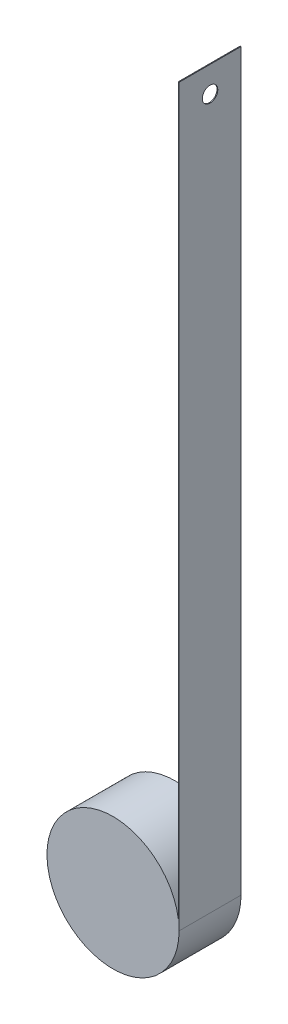
ISO-10303-21;
HEADER;
FILE_DESCRIPTION(('STEP AP214'),'2;1');
FILE_NAME('part.step','',(''),(''),'','','');
FILE_SCHEMA(('AUTOMOTIVE_DESIGN { 1 0 10303 214 1 1 1 1 }'));
ENDSEC;
DATA;
#1=APPLICATION_CONTEXT('core data for automotive mechanical design processes');
#2=APPLICATION_PROTOCOL_DEFINITION('international standard','automotive_design',2000,#1);
#3=PRODUCT_CONTEXT('',#1,'mechanical');
#4=PRODUCT('Part','Part','',(#3));
#5=PRODUCT_RELATED_PRODUCT_CATEGORY('part','',(#4));
#6=PRODUCT_DEFINITION_FORMATION('','',#4);
#7=PRODUCT_DEFINITION_CONTEXT('part definition',#1,'design');
#8=PRODUCT_DEFINITION('design','',#6,#7);
#9=PRODUCT_DEFINITION_SHAPE('','',#8);
#10=(LENGTH_UNIT() NAMED_UNIT(*) SI_UNIT(.MILLI.,.METRE.));
#11=(NAMED_UNIT(*) PLANE_ANGLE_UNIT() SI_UNIT($,.RADIAN.));
#12=(NAMED_UNIT(*) SI_UNIT($,.STERADIAN.) SOLID_ANGLE_UNIT());
#13=UNCERTAINTY_MEASURE_WITH_UNIT(LENGTH_MEASURE(1.E-05),#10,'distance_accuracy_value','');
#14=(GEOMETRIC_REPRESENTATION_CONTEXT(3) GLOBAL_UNCERTAINTY_ASSIGNED_CONTEXT((#13)) GLOBAL_UNIT_ASSIGNED_CONTEXT((#10,
#11,#12)) REPRESENTATION_CONTEXT('',''));
#15=CARTESIAN_POINT('',(0.,0.,0.));
#16=DIRECTION('',(0.,0.,1.));
#17=DIRECTION('',(1.,0.,0.));
#18=AXIS2_PLACEMENT_3D('',#15,#16,#17);
#19=CARTESIAN_POINT('',(0.,0.,19.05));
#20=DIRECTION('',(0.,0.,-1.));
#21=DIRECTION('',(-1.,0.,0.));
#22=AXIS2_PLACEMENT_3D('',#19,#20,#21);
#23=CYLINDRICAL_SURFACE('',#22,20.32);
#24=CARTESIAN_POINT('',(0.,0.,0.));
#25=DIRECTION('',(0.,0.,1.));
#26=DIRECTION('',(1.,0.,0.));
#27=AXIS2_PLACEMENT_3D('',#24,#25,#26);
#28=CIRCLE('',#27,20.32);
#29=CARTESIAN_POINT('',(20.066,3.20281813408117,0.));
#30=VERTEX_POINT('',#29);
#31=CARTESIAN_POINT('',(20.32,0.,0.));
#32=VERTEX_POINT('',#31);
#33=EDGE_CURVE('E397',#30,#32,#28,.T.);
#34=ORIENTED_EDGE('',*,*,#33,.T.);
#35=DIRECTION('',(0.,0.,-1.));
#36=VECTOR('',#35,1.);
#37=CARTESIAN_POINT('',(20.32,0.,19.05));
#38=LINE('',#37,#36);
#39=CARTESIAN_POINT('',(20.32,0.,19.05));
#40=VERTEX_POINT('',#39);
#41=EDGE_CURVE('E11',#40,#32,#38,.T.);
#42=ORIENTED_EDGE('',*,*,#41,.F.);
#43=CARTESIAN_POINT('',(0.,0.,19.05));
#44=DIRECTION('',(0.,0.,1.));
#45=DIRECTION('',(1.,0.,0.));
#46=AXIS2_PLACEMENT_3D('',#43,#44,#45);
#47=CIRCLE('',#46,20.32);
#48=CARTESIAN_POINT('',(20.066,3.20281813408117,19.05));
#49=VERTEX_POINT('',#48);
#50=EDGE_CURVE('E418',#49,#40,#47,.T.);
#51=ORIENTED_EDGE('',*,*,#50,.F.);
#52=DIRECTION('',(0.,0.,-1.));
#53=VECTOR('',#52,1.);
#54=CARTESIAN_POINT('',(20.066,3.20281813408117,19.05));
#55=LINE('',#54,#53);
#56=EDGE_CURVE('E409',#49,#30,#55,.T.);
#57=ORIENTED_EDGE('',*,*,#56,.T.);
#58=EDGE_LOOP('',(#34,#42,#51,#57));
#59=FACE_BOUND('',#58,.T.);
#60=ADVANCED_FACE('F352',(#59),#23,.T.);
#61=CARTESIAN_POINT('',(20.32,0.,19.05));
#62=DIRECTION('',(-1.,0.,0.));
#63=DIRECTION('',(0.,-1.,0.));
#64=AXIS2_PLACEMENT_3D('',#61,#62,#63);
#65=PLANE('',#64);
#66=CARTESIAN_POINT('',(20.32,218.1225,9.525));
#67=DIRECTION('',(1.,0.,0.));
#68=DIRECTION('',(0.,1.,0.));
#69=AXIS2_PLACEMENT_3D('',#66,#67,#68);
#70=CIRCLE('',#69,2.38125);
#71=CARTESIAN_POINT('',(20.32,220.50375,9.525));
#72=VERTEX_POINT('',#71);
#73=EDGE_CURVE('E412',#72,#72,#70,.T.);
#74=ORIENTED_EDGE('',*,*,#73,.F.);
#75=EDGE_LOOP('',(#74));
#76=FACE_BOUND('',#75,.T.);
#77=DIRECTION('',(0.,1.,0.));
#78=VECTOR('',#77,1.);
#79=CARTESIAN_POINT('',(20.32,0.,0.));
#80=LINE('',#79,#78);
#81=CARTESIAN_POINT('',(20.32,226.06,0.));
#82=VERTEX_POINT('',#81);
#83=EDGE_CURVE('E393',#32,#82,#80,.T.);
#84=ORIENTED_EDGE('',*,*,#83,.T.);
#85=DIRECTION('',(0.,0.,-1.));
#86=VECTOR('',#85,1.);
#87=CARTESIAN_POINT('',(20.32,226.06,19.05));
#88=LINE('',#87,#86);
#89=CARTESIAN_POINT('',(20.32,226.06,19.05));
#90=VERTEX_POINT('',#89);
#91=EDGE_CURVE('E360',#90,#82,#88,.T.);
#92=ORIENTED_EDGE('',*,*,#91,.F.);
#93=DIRECTION('',(0.,1.,0.));
#94=VECTOR('',#93,1.);
#95=CARTESIAN_POINT('',(20.32,0.,19.05));
#96=LINE('',#95,#94);
#97=EDGE_CURVE('E405',#40,#90,#96,.T.);
#98=ORIENTED_EDGE('',*,*,#97,.F.);
#99=ORIENTED_EDGE('',*,*,#41,.T.);
#100=EDGE_LOOP('',(#84,#92,#98,#99));
#101=FACE_BOUND('',#100,.T.);
#102=ADVANCED_FACE('F404',(#76,#101),#65,.F.);
#103=CARTESIAN_POINT('',(20.32,226.06,19.05));
#104=DIRECTION('',(0.,-1.,0.));
#105=DIRECTION('',(0.,0.,-1.));
#106=AXIS2_PLACEMENT_3D('',#103,#104,#105);
#107=PLANE('',#106);
#108=DIRECTION('',(-1.,0.,0.));
#109=VECTOR('',#108,1.);
#110=CARTESIAN_POINT('',(20.32,226.06,0.));
#111=LINE('',#110,#109);
#112=CARTESIAN_POINT('',(20.066,226.06,0.));
#113=VERTEX_POINT('',#112);
#114=EDGE_CURVE('E398',#82,#113,#111,.T.);
#115=ORIENTED_EDGE('',*,*,#114,.T.);
#116=DIRECTION('',(0.,0.,-1.));
#117=VECTOR('',#116,1.);
#118=CARTESIAN_POINT('',(20.066,226.06,19.05));
#119=LINE('',#118,#117);
#120=CARTESIAN_POINT('',(20.066,226.06,19.05));
#121=VERTEX_POINT('',#120);
#122=EDGE_CURVE('E424',#121,#113,#119,.T.);
#123=ORIENTED_EDGE('',*,*,#122,.F.);
#124=DIRECTION('',(-1.,0.,0.));
#125=VECTOR('',#124,1.);
#126=CARTESIAN_POINT('',(20.32,226.06,19.05));
#127=LINE('',#126,#125);
#128=EDGE_CURVE('E372',#90,#121,#127,.T.);
#129=ORIENTED_EDGE('',*,*,#128,.F.);
#130=ORIENTED_EDGE('',*,*,#91,.T.);
#131=EDGE_LOOP('',(#115,#123,#129,#130));
#132=FACE_BOUND('',#131,.T.);
#133=ADVANCED_FACE('F428',(#132),#107,.F.);
#134=CARTESIAN_POINT('',(20.066,226.06,19.05));
#135=DIRECTION('',(1.,0.,0.));
#136=DIRECTION('',(0.,1.,0.));
#137=AXIS2_PLACEMENT_3D('',#134,#135,#136);
#138=PLANE('',#137);
#139=CARTESIAN_POINT('',(20.066,218.1225,9.525));
#140=DIRECTION('',(1.,0.,0.));
#141=DIRECTION('',(0.,1.,0.));
#142=AXIS2_PLACEMENT_3D('',#139,#140,#141);
#143=CIRCLE('',#142,2.38125);
#144=CARTESIAN_POINT('',(20.066,220.50375,9.525));
#145=VERTEX_POINT('',#144);
#146=EDGE_CURVE('E355',#145,#145,#143,.T.);
#147=ORIENTED_EDGE('',*,*,#146,.T.);
#148=EDGE_LOOP('',(#147));
#149=FACE_BOUND('',#148,.T.);
#150=DIRECTION('',(0.,-1.,0.));
#151=VECTOR('',#150,1.);
#152=CARTESIAN_POINT('',(20.066,226.06,0.));
#153=LINE('',#152,#151);
#154=EDGE_CURVE('E416',#113,#30,#153,.T.);
#155=ORIENTED_EDGE('',*,*,#154,.T.);
#156=ORIENTED_EDGE('',*,*,#56,.F.);
#157=DIRECTION('',(0.,-1.,0.));
#158=VECTOR('',#157,1.);
#159=CARTESIAN_POINT('',(20.066,226.06,19.05));
#160=LINE('',#159,#158);
#161=EDGE_CURVE('E367',#121,#49,#160,.T.);
#162=ORIENTED_EDGE('',*,*,#161,.F.);
#163=ORIENTED_EDGE('',*,*,#122,.T.);
#164=EDGE_LOOP('',(#155,#156,#162,#163));
#165=FACE_BOUND('',#164,.T.);
#166=ADVANCED_FACE('F430',(#149,#165),#138,.F.);
#167=CARTESIAN_POINT('',(0.,0.,19.05));
#168=DIRECTION('',(0.,0.,1.));
#169=DIRECTION('',(1.,0.,0.));
#170=AXIS2_PLACEMENT_3D('',#167,#168,#169);
#171=PLANE('',#170);
#172=ORIENTED_EDGE('',*,*,#50,.T.);
#173=ORIENTED_EDGE('',*,*,#97,.T.);
#174=ORIENTED_EDGE('',*,*,#128,.T.);
#175=ORIENTED_EDGE('',*,*,#161,.T.);
#176=EDGE_LOOP('',(#172,#173,#174,#175));
#177=FACE_BOUND('',#176,.T.);
#178=ADVANCED_FACE('F431',(#177),#171,.T.);
#179=CARTESIAN_POINT('',(0.,0.,0.));
#180=DIRECTION('',(0.,0.,1.));
#181=DIRECTION('',(1.,0.,0.));
#182=AXIS2_PLACEMENT_3D('',#179,#180,#181);
#183=PLANE('',#182);
#184=ORIENTED_EDGE('',*,*,#33,.F.);
#185=ORIENTED_EDGE('',*,*,#154,.F.);
#186=ORIENTED_EDGE('',*,*,#114,.F.);
#187=ORIENTED_EDGE('',*,*,#83,.F.);
#188=EDGE_LOOP('',(#184,#185,#186,#187));
#189=FACE_BOUND('',#188,.T.);
#190=ADVANCED_FACE('F394',(#189),#183,.F.);
#191=CARTESIAN_POINT('',(-20.32,218.1225,9.525));
#192=DIRECTION('',(1.,0.,0.));
#193=DIRECTION('',(0.,1.,0.));
#194=AXIS2_PLACEMENT_3D('',#191,#192,#193);
#195=CYLINDRICAL_SURFACE('',#194,2.38125);
#196=ORIENTED_EDGE('',*,*,#73,.T.);
#197=EDGE_LOOP('',(#196));
#198=FACE_BOUND('',#197,.T.);
#199=ORIENTED_EDGE('',*,*,#146,.F.);
#200=EDGE_LOOP('',(#199));
#201=FACE_BOUND('',#200,.T.);
#202=ADVANCED_FACE('F438',(#198,#201),#195,.F.);
#203=CLOSED_SHELL('',(#60,#102,#133,#166,#178,#190,#202));
#204=MANIFOLD_SOLID_BREP('B2',#203);
#205=ADVANCED_BREP_SHAPE_REPRESENTATION('',(#18,#204),#14);
#206=SHAPE_DEFINITION_REPRESENTATION(#9,#205);
ENDSEC;
END-ISO-10303-21;
